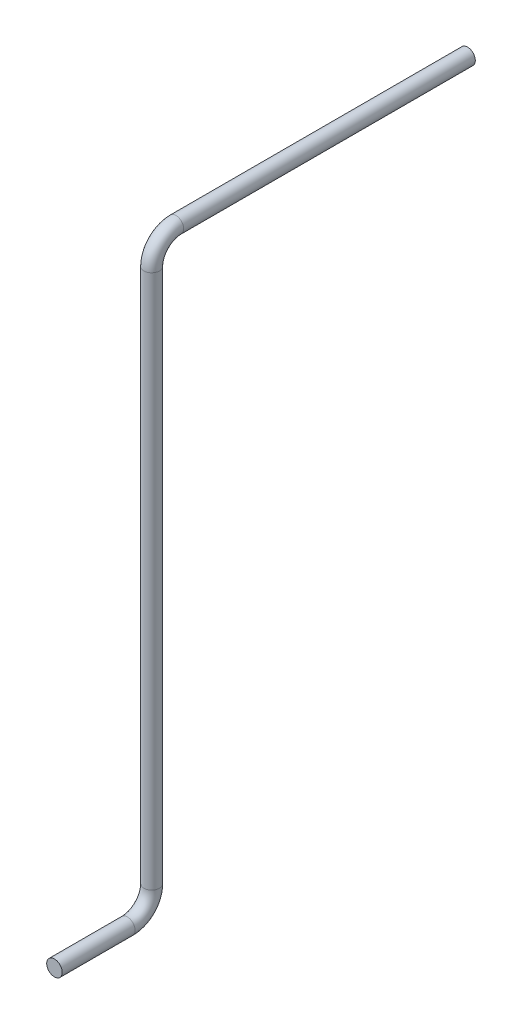
ISO-10303-21;
HEADER;
FILE_DESCRIPTION(('STEP AP214'),'2;1');
FILE_NAME('part.step','',(''),(''),'','','');
FILE_SCHEMA(('AUTOMOTIVE_DESIGN { 1 0 10303 214 1 1 1 1 }'));
ENDSEC;
DATA;
#1=APPLICATION_CONTEXT('core data for automotive mechanical design processes');
#2=APPLICATION_PROTOCOL_DEFINITION('international standard','automotive_design',2000,#1);
#3=PRODUCT_CONTEXT('',#1,'mechanical');
#4=PRODUCT('Part','Part','',(#3));
#5=PRODUCT_RELATED_PRODUCT_CATEGORY('part','',(#4));
#6=PRODUCT_DEFINITION_FORMATION('','',#4);
#7=PRODUCT_DEFINITION_CONTEXT('part definition',#1,'design');
#8=PRODUCT_DEFINITION('design','',#6,#7);
#9=PRODUCT_DEFINITION_SHAPE('','',#8);
#10=(LENGTH_UNIT() NAMED_UNIT(*) SI_UNIT(.MILLI.,.METRE.));
#11=(NAMED_UNIT(*) PLANE_ANGLE_UNIT() SI_UNIT($,.RADIAN.));
#12=(NAMED_UNIT(*) SI_UNIT($,.STERADIAN.) SOLID_ANGLE_UNIT());
#13=UNCERTAINTY_MEASURE_WITH_UNIT(LENGTH_MEASURE(1.E-05),#10,'distance_accuracy_value','');
#14=(GEOMETRIC_REPRESENTATION_CONTEXT(3) GLOBAL_UNCERTAINTY_ASSIGNED_CONTEXT((#13)) GLOBAL_UNIT_ASSIGNED_CONTEXT((#10,
#11,#12)) REPRESENTATION_CONTEXT('',''));
#15=CARTESIAN_POINT('',(0.,0.,0.));
#16=DIRECTION('',(0.,0.,1.));
#17=DIRECTION('',(1.,0.,0.));
#18=AXIS2_PLACEMENT_3D('',#15,#16,#17);
#19=CARTESIAN_POINT('',(0.,120.,-25.));
#20=DIRECTION('',(0.,0.,-1.));
#21=DIRECTION('',(-1.,0.,0.));
#22=AXIS2_PLACEMENT_3D('',#19,#20,#21);
#23=CYLINDRICAL_SURFACE('',#22,1.6);
#24=CARTESIAN_POINT('',(0.,120.,-25.));
#25=DIRECTION('',(0.,0.,1.));
#26=DIRECTION('',(1.,0.,0.));
#27=AXIS2_PLACEMENT_3D('',#24,#25,#26);
#28=CIRCLE('',#27,1.6);
#29=CARTESIAN_POINT('',(0.,121.6,-25.));
#30=VERTEX_POINT('',#29);
#31=EDGE_CURVE('E37',#30,#30,#28,.T.);
#32=ORIENTED_EDGE('',*,*,#31,.F.);
#33=EDGE_LOOP('',(#32));
#34=FACE_BOUND('',#33,.T.);
#35=CARTESIAN_POINT('',(0.,120.,-85.));
#36=DIRECTION('',(0.,0.,1.));
#37=DIRECTION('',(1.,0.,0.));
#38=AXIS2_PLACEMENT_3D('',#35,#36,#37);
#39=CIRCLE('',#38,1.6);
#40=CARTESIAN_POINT('',(1.6,120.,-85.));
#41=VERTEX_POINT('',#40);
#42=EDGE_CURVE('E10',#41,#41,#39,.T.);
#43=ORIENTED_EDGE('',*,*,#42,.T.);
#44=EDGE_LOOP('',(#43));
#45=FACE_BOUND('',#44,.T.);
#46=ADVANCED_FACE('F31',(#34,#45),#23,.T.);
#47=CARTESIAN_POINT('',(0.,115.,-25.));
#48=DIRECTION('',(-1.,0.,0.));
#49=DIRECTION('',(0.,0.,1.));
#50=AXIS2_PLACEMENT_3D('',#47,#48,#49);
#51=TOROIDAL_SURFACE('',#50,5.,1.6);
#52=CARTESIAN_POINT('',(0.,115.,-20.));
#53=DIRECTION('',(0.,-1.,0.));
#54=DIRECTION('',(1.,0.,0.));
#55=AXIS2_PLACEMENT_3D('',#52,#53,#54);
#56=CIRCLE('',#55,1.6);
#57=CARTESIAN_POINT('',(0.,115.,-18.4));
#58=VERTEX_POINT('',#57);
#59=EDGE_CURVE('E41',#58,#58,#56,.T.);
#60=CARTESIAN_POINT('',(0.,115.,-25.));
#61=DIRECTION('',(-1.,0.,0.));
#62=DIRECTION('',(0.,0.,1.));
#63=AXIS2_PLACEMENT_3D('',#60,#61,#62);
#64=CIRCLE('',#63,6.59999999999999);
#65=EDGE_CURVE('',#58,#30,#64,.T.);
#66=ORIENTED_EDGE('',*,*,#59,.F.);
#67=ORIENTED_EDGE('',*,*,#31,.T.);
#68=ORIENTED_EDGE('',*,*,#65,.T.);
#69=ORIENTED_EDGE('',*,*,#65,.F.);
#70=EDGE_LOOP('',(#66,#68,#67,#69));
#71=FACE_BOUND('',#70,.T.);
#72=ADVANCED_FACE('F69',(#71),#51,.T.);
#73=CARTESIAN_POINT('',(0.,5.,-20.));
#74=DIRECTION('',(0.,1.,0.));
#75=DIRECTION('',(0.,0.,1.));
#76=AXIS2_PLACEMENT_3D('',#73,#74,#75);
#77=CYLINDRICAL_SURFACE('',#76,1.6);
#78=CARTESIAN_POINT('',(0.,5.,-20.));
#79=DIRECTION('',(0.,-1.,0.));
#80=DIRECTION('',(1.,0.,0.));
#81=AXIS2_PLACEMENT_3D('',#78,#79,#80);
#82=CIRCLE('',#81,1.6);
#83=CARTESIAN_POINT('',(0.,5.,-21.6));
#84=VERTEX_POINT('',#83);
#85=EDGE_CURVE('E45',#84,#84,#82,.T.);
#86=ORIENTED_EDGE('',*,*,#85,.F.);
#87=EDGE_LOOP('',(#86));
#88=FACE_BOUND('',#87,.T.);
#89=ORIENTED_EDGE('',*,*,#59,.T.);
#90=EDGE_LOOP('',(#89));
#91=FACE_BOUND('',#90,.T.);
#92=ADVANCED_FACE('F63',(#88,#91),#77,.T.);
#93=CARTESIAN_POINT('',(0.,5.,-15.));
#94=DIRECTION('',(1.,0.,0.));
#95=DIRECTION('',(0.,0.,-1.));
#96=AXIS2_PLACEMENT_3D('',#93,#94,#95);
#97=TOROIDAL_SURFACE('',#96,5.,1.6);
#98=CARTESIAN_POINT('',(0.,0.,-15.));
#99=DIRECTION('',(0.,0.,1.));
#100=DIRECTION('',(1.,0.,0.));
#101=AXIS2_PLACEMENT_3D('',#98,#99,#100);
#102=CIRCLE('',#101,1.6);
#103=CARTESIAN_POINT('',(0.,-1.6,-15.));
#104=VERTEX_POINT('',#103);
#105=EDGE_CURVE('E50',#104,#104,#102,.T.);
#106=CARTESIAN_POINT('',(0.,5.,-15.));
#107=DIRECTION('',(1.,0.,0.));
#108=DIRECTION('',(0.,0.,-1.));
#109=AXIS2_PLACEMENT_3D('',#106,#107,#108);
#110=CIRCLE('',#109,6.6);
#111=EDGE_CURVE('',#104,#84,#110,.T.);
#112=ORIENTED_EDGE('',*,*,#105,.F.);
#113=ORIENTED_EDGE('',*,*,#85,.T.);
#114=ORIENTED_EDGE('',*,*,#111,.T.);
#115=ORIENTED_EDGE('',*,*,#111,.F.);
#116=EDGE_LOOP('',(#112,#114,#113,#115));
#117=FACE_BOUND('',#116,.T.);
#118=ADVANCED_FACE('F60',(#117),#97,.T.);
#119=CARTESIAN_POINT('',(0.,0.,-15.));
#120=DIRECTION('',(0.,0.,1.));
#121=DIRECTION('',(1.,0.,0.));
#122=AXIS2_PLACEMENT_3D('',#119,#120,#121);
#123=CYLINDRICAL_SURFACE('',#122,1.6);
#124=ORIENTED_EDGE('',*,*,#105,.T.);
#125=EDGE_LOOP('',(#124));
#126=FACE_BOUND('',#125,.T.);
#127=CARTESIAN_POINT('',(0.,0.,0.));
#128=DIRECTION('',(0.,0.,1.));
#129=DIRECTION('',(1.,0.,0.));
#130=AXIS2_PLACEMENT_3D('',#127,#128,#129);
#131=CIRCLE('',#130,1.6);
#132=CARTESIAN_POINT('',(1.6,0.,0.));
#133=VERTEX_POINT('',#132);
#134=EDGE_CURVE('E51',#133,#133,#131,.T.);
#135=ORIENTED_EDGE('',*,*,#134,.F.);
#136=EDGE_LOOP('',(#135));
#137=FACE_BOUND('',#136,.T.);
#138=ADVANCED_FACE('F57',(#126,#137),#123,.T.);
#139=CARTESIAN_POINT('',(0.,120.,-85.));
#140=DIRECTION('',(0.,0.,1.));
#141=DIRECTION('',(1.,0.,0.));
#142=AXIS2_PLACEMENT_3D('',#139,#140,#141);
#143=PLANE('',#142);
#144=ORIENTED_EDGE('',*,*,#42,.F.);
#145=EDGE_LOOP('',(#144));
#146=FACE_BOUND('',#145,.T.);
#147=ADVANCED_FACE('F81',(#146),#143,.F.);
#148=CARTESIAN_POINT('',(0.,0.,0.));
#149=DIRECTION('',(0.,0.,1.));
#150=DIRECTION('',(1.,0.,0.));
#151=AXIS2_PLACEMENT_3D('',#148,#149,#150);
#152=PLANE('',#151);
#153=ORIENTED_EDGE('',*,*,#134,.T.);
#154=EDGE_LOOP('',(#153));
#155=FACE_BOUND('',#154,.T.);
#156=ADVANCED_FACE('F82',(#155),#152,.T.);
#157=CLOSED_SHELL('',(#46,#72,#92,#118,#138,#147,#156));
#158=MANIFOLD_SOLID_BREP('B2',#157);
#159=ADVANCED_BREP_SHAPE_REPRESENTATION('',(#18,#158),#14);
#160=SHAPE_DEFINITION_REPRESENTATION(#9,#159);
ENDSEC;
END-ISO-10303-21;
